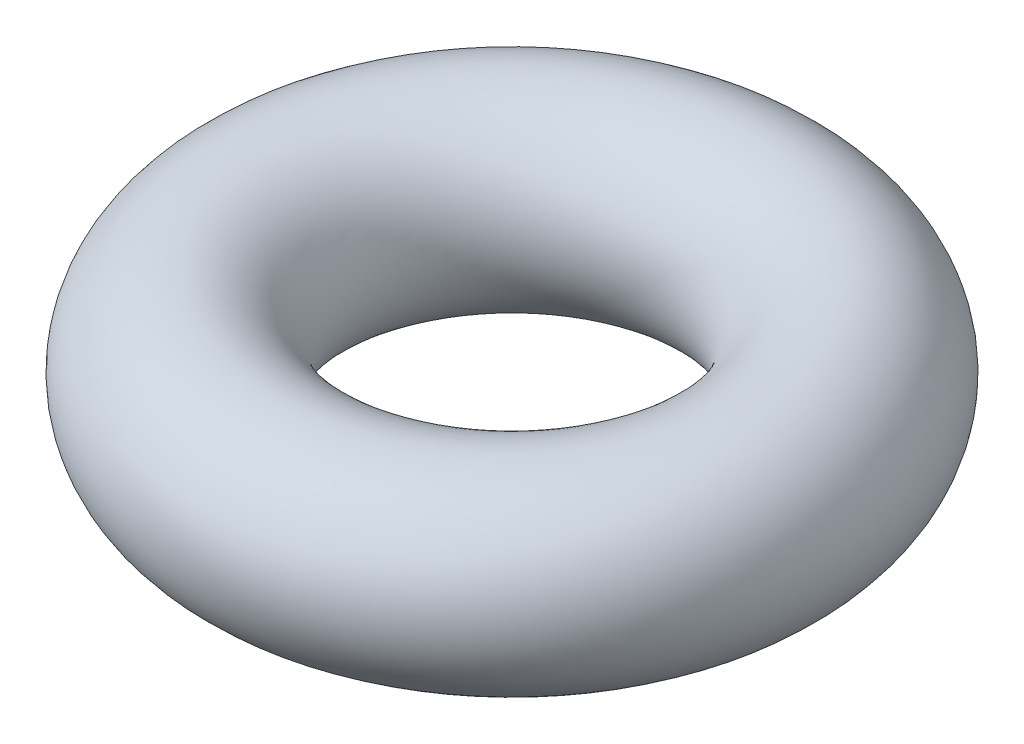
ISO-10303-21;
HEADER;
FILE_DESCRIPTION(('STEP AP214'),'2;1');
FILE_NAME('part.step','',(''),(''),'','','');
FILE_SCHEMA(('AUTOMOTIVE_DESIGN { 1 0 10303 214 1 1 1 1 }'));
ENDSEC;
DATA;
#1=APPLICATION_CONTEXT('core data for automotive mechanical design processes');
#2=APPLICATION_PROTOCOL_DEFINITION('international standard','automotive_design',2000,#1);
#3=PRODUCT_CONTEXT('',#1,'mechanical');
#4=PRODUCT('Part','Part','',(#3));
#5=PRODUCT_RELATED_PRODUCT_CATEGORY('part','',(#4));
#6=PRODUCT_DEFINITION_FORMATION('','',#4);
#7=PRODUCT_DEFINITION_CONTEXT('part definition',#1,'design');
#8=PRODUCT_DEFINITION('design','',#6,#7);
#9=PRODUCT_DEFINITION_SHAPE('','',#8);
#10=(LENGTH_UNIT() NAMED_UNIT(*) SI_UNIT(.MILLI.,.METRE.));
#11=(NAMED_UNIT(*) PLANE_ANGLE_UNIT() SI_UNIT($,.RADIAN.));
#12=(NAMED_UNIT(*) SI_UNIT($,.STERADIAN.) SOLID_ANGLE_UNIT());
#13=UNCERTAINTY_MEASURE_WITH_UNIT(LENGTH_MEASURE(1.E-05),#10,'distance_accuracy_value','');
#14=(GEOMETRIC_REPRESENTATION_CONTEXT(3) GLOBAL_UNCERTAINTY_ASSIGNED_CONTEXT((#13)) GLOBAL_UNIT_ASSIGNED_CONTEXT((#10,
#11,#12)) REPRESENTATION_CONTEXT('',''));
#15=CARTESIAN_POINT('',(0.,0.,0.));
#16=DIRECTION('',(0.,0.,1.));
#17=DIRECTION('',(1.,0.,0.));
#18=AXIS2_PLACEMENT_3D('',#15,#16,#17);
#19=CARTESIAN_POINT('',(0.,0.,0.));
#20=DIRECTION('',(0.,1.,0.));
#21=DIRECTION('',(0.,0.,1.));
#22=AXIS2_PLACEMENT_3D('',#19,#20,#21);
#23=TOROIDAL_SURFACE('',#22,100.,40.);
#24=CARTESIAN_POINT('',(0.,0.,140.));
#25=VERTEX_POINT('',#24);
#26=VERTEX_LOOP('',#25);
#27=FACE_BOUND('',#26,.T.);
#28=ADVANCED_FACE('F34',(#27),#23,.T.);
#29=CLOSED_SHELL('',(#28));
#30=CARTESIAN_POINT('',(0.,0.,0.));
#31=DIRECTION('',(0.,1.,0.));
#32=DIRECTION('',(0.,0.,1.));
#33=AXIS2_PLACEMENT_3D('',#30,#31,#32);
#34=TOROIDAL_SURFACE('',#33,100.,30.);
#35=CARTESIAN_POINT('',(0.,0.,130.));
#36=VERTEX_POINT('',#35);
#37=VERTEX_LOOP('',#36);
#38=FACE_BOUND('',#37,.T.);
#39=ADVANCED_FACE('F46',(#38),#34,.F.);
#40=CLOSED_SHELL('',(#39));
#41=ORIENTED_CLOSED_SHELL('',*,#40,.T.);
#42=BREP_WITH_VOIDS('B2',#29,(#41));
#43=ADVANCED_BREP_SHAPE_REPRESENTATION('',(#18,#42),#14);
#44=SHAPE_DEFINITION_REPRESENTATION(#9,#43);
ENDSEC;
END-ISO-10303-21;
